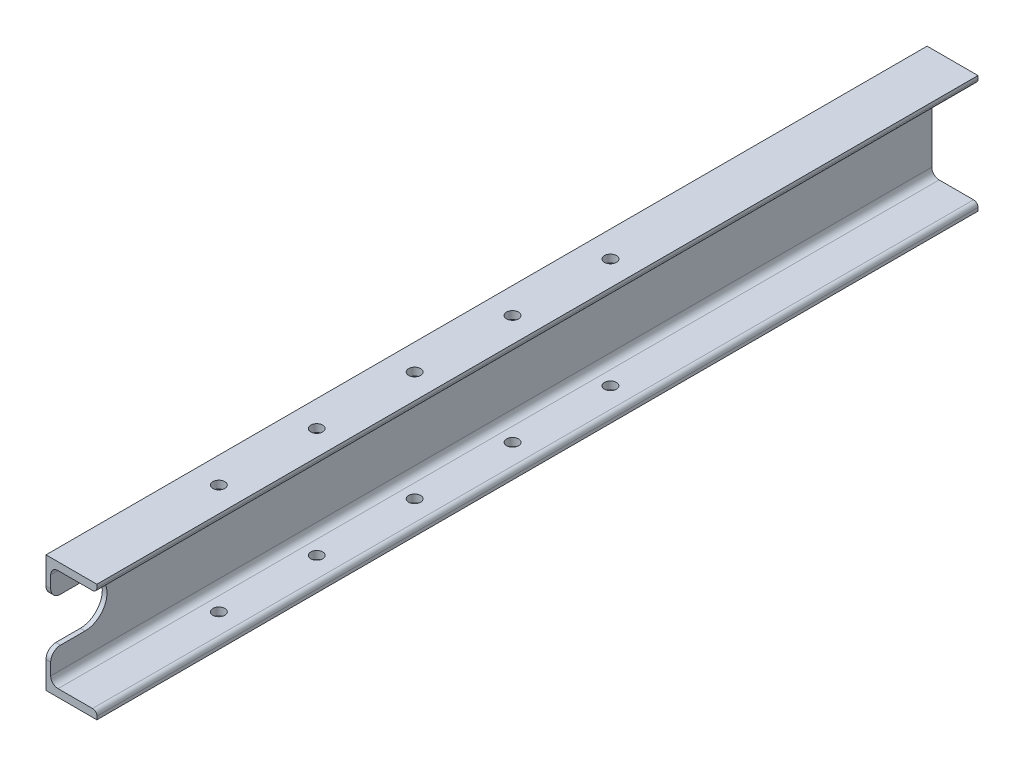
ISO-10303-21;
HEADER;
FILE_DESCRIPTION(('STEP AP214'),'2;1');
FILE_NAME('part.step','',(''),(''),'','','');
FILE_SCHEMA(('AUTOMOTIVE_DESIGN { 1 0 10303 214 1 1 1 1 }'));
ENDSEC;
DATA;
#1=APPLICATION_CONTEXT('core data for automotive mechanical design processes');
#2=APPLICATION_PROTOCOL_DEFINITION('international standard','automotive_design',2000,#1);
#3=PRODUCT_CONTEXT('',#1,'mechanical');
#4=PRODUCT('Part','Part','',(#3));
#5=PRODUCT_RELATED_PRODUCT_CATEGORY('part','',(#4));
#6=PRODUCT_DEFINITION_FORMATION('','',#4);
#7=PRODUCT_DEFINITION_CONTEXT('part definition',#1,'design');
#8=PRODUCT_DEFINITION('design','',#6,#7);
#9=PRODUCT_DEFINITION_SHAPE('','',#8);
#10=(LENGTH_UNIT() NAMED_UNIT(*) SI_UNIT(.MILLI.,.METRE.));
#11=(NAMED_UNIT(*) PLANE_ANGLE_UNIT() SI_UNIT($,.RADIAN.));
#12=(NAMED_UNIT(*) SI_UNIT($,.STERADIAN.) SOLID_ANGLE_UNIT());
#13=UNCERTAINTY_MEASURE_WITH_UNIT(LENGTH_MEASURE(1.E-05),#10,'distance_accuracy_value','');
#14=(GEOMETRIC_REPRESENTATION_CONTEXT(3) GLOBAL_UNCERTAINTY_ASSIGNED_CONTEXT((#13)) GLOBAL_UNIT_ASSIGNED_CONTEXT((#10,
#11,#12)) REPRESENTATION_CONTEXT('',''));
#15=CARTESIAN_POINT('',(0.,0.,0.));
#16=DIRECTION('',(0.,0.,1.));
#17=DIRECTION('',(1.,0.,0.));
#18=AXIS2_PLACEMENT_3D('',#15,#16,#17);
#19=CARTESIAN_POINT('',(47.5,56.7,450.));
#20=DIRECTION('',(0.,0.,-1.));
#21=DIRECTION('',(-1.,0.,0.));
#22=AXIS2_PLACEMENT_3D('',#19,#20,#21);
#23=PLANE('',#22);
#24=DIRECTION('',(0.,-1.,0.));
#25=VECTOR('',#24,1.);
#26=CARTESIAN_POINT('',(0.,-60.,450.));
#27=LINE('',#26,#25);
#28=CARTESIAN_POINT('',(0.,60.,450.));
#29=VERTEX_POINT('',#28);
#30=CARTESIAN_POINT('',(0.,32.5,450.));
#31=VERTEX_POINT('',#30);
#32=EDGE_CURVE('E297',#29,#31,#27,.T.);
#33=ORIENTED_EDGE('',*,*,#32,.T.);
#34=DIRECTION('',(1.,0.,0.));
#35=VECTOR('',#34,1.);
#36=CARTESIAN_POINT('',(47.5,32.5,450.));
#37=LINE('',#36,#35);
#38=CARTESIAN_POINT('',(4.80000000000001,32.5,450.));
#39=VERTEX_POINT('',#38);
#40=EDGE_CURVE('E55',#31,#39,#37,.T.);
#41=ORIENTED_EDGE('',*,*,#40,.T.);
#42=DIRECTION('',(0.,1.,0.));
#43=VECTOR('',#42,1.);
#44=CARTESIAN_POINT('',(4.80000000000001,44.6999999999999,450.));
#45=LINE('',#44,#43);
#46=CARTESIAN_POINT('',(4.80000000000001,44.6999999999999,450.));
#47=VERTEX_POINT('',#46);
#48=EDGE_CURVE('E316',#39,#47,#45,.T.);
#49=ORIENTED_EDGE('',*,*,#48,.T.);
#50=CARTESIAN_POINT('',(12.3,44.7,450.));
#51=DIRECTION('',(0.,0.,-1.));
#52=DIRECTION('',(1.,0.,0.));
#53=AXIS2_PLACEMENT_3D('',#50,#51,#52);
#54=CIRCLE('',#53,7.5);
#55=CARTESIAN_POINT('',(12.3000000000001,52.2,450.));
#56=VERTEX_POINT('',#55);
#57=EDGE_CURVE('E321',#47,#56,#54,.T.);
#58=ORIENTED_EDGE('',*,*,#57,.T.);
#59=DIRECTION('',(1.,0.,0.));
#60=VECTOR('',#59,1.);
#61=CARTESIAN_POINT('',(47.5,52.2,450.));
#62=LINE('',#61,#60);
#63=CARTESIAN_POINT('',(47.5,52.2,450.));
#64=VERTEX_POINT('',#63);
#65=EDGE_CURVE('E324',#56,#64,#62,.T.);
#66=ORIENTED_EDGE('',*,*,#65,.T.);
#67=CARTESIAN_POINT('',(47.5,56.7,450.));
#68=DIRECTION('',(0.,0.,1.));
#69=DIRECTION('',(-1.,0.,0.));
#70=AXIS2_PLACEMENT_3D('',#67,#68,#69);
#71=CIRCLE('',#70,4.5);
#72=CARTESIAN_POINT('',(52.,56.7,450.));
#73=VERTEX_POINT('',#72);
#74=EDGE_CURVE('E327',#64,#73,#71,.T.);
#75=ORIENTED_EDGE('',*,*,#74,.T.);
#76=DIRECTION('',(0.,1.,0.));
#77=VECTOR('',#76,1.);
#78=CARTESIAN_POINT('',(52.,60.,450.));
#79=LINE('',#78,#77);
#80=CARTESIAN_POINT('',(52.,60.,450.));
#81=VERTEX_POINT('',#80);
#82=EDGE_CURVE('E330',#73,#81,#79,.T.);
#83=ORIENTED_EDGE('',*,*,#82,.T.);
#84=DIRECTION('',(-1.,0.,0.));
#85=VECTOR('',#84,1.);
#86=CARTESIAN_POINT('',(0.,60.,450.));
#87=LINE('',#86,#85);
#88=EDGE_CURVE('E291',#81,#29,#87,.T.);
#89=ORIENTED_EDGE('',*,*,#88,.T.);
#90=EDGE_LOOP('',(#33,#41,#49,#58,#66,#75,#83,#89));
#91=FACE_BOUND('',#90,.T.);
#92=ADVANCED_FACE('F45',(#91),#23,.F.);
#93=CARTESIAN_POINT('',(0.,60.,450.));
#94=DIRECTION('',(0.,-1.,0.));
#95=DIRECTION('',(1.,0.,0.));
#96=AXIS2_PLACEMENT_3D('',#93,#94,#95);
#97=PLANE('',#96);
#98=CARTESIAN_POINT('',(26.5507517231734,60.,300.));
#99=DIRECTION('',(0.,-1.,0.));
#100=DIRECTION('',(1.,0.,0.));
#101=AXIS2_PLACEMENT_3D('',#98,#99,#100);
#102=CIRCLE('',#101,6.10000000000003);
#103=CARTESIAN_POINT('',(32.6507517231734,60.,300.));
#104=VERTEX_POINT('',#103);
#105=EDGE_CURVE('E195',#104,#104,#102,.T.);
#106=ORIENTED_EDGE('',*,*,#105,.T.);
#107=EDGE_LOOP('',(#106));
#108=FACE_BOUND('',#107,.T.);
#109=CARTESIAN_POINT('',(26.5507517231731,60.,200.));
#110=DIRECTION('',(0.,-1.,0.));
#111=DIRECTION('',(1.,0.,0.));
#112=AXIS2_PLACEMENT_3D('',#109,#110,#111);
#113=CIRCLE('',#112,6.10000000000003);
#114=CARTESIAN_POINT('',(32.6507517231731,60.,200.));
#115=VERTEX_POINT('',#114);
#116=EDGE_CURVE('E256',#115,#115,#113,.T.);
#117=ORIENTED_EDGE('',*,*,#116,.T.);
#118=EDGE_LOOP('',(#117));
#119=FACE_BOUND('',#118,.T.);
#120=CARTESIAN_POINT('',(26.5507517231727,60.,100.));
#121=DIRECTION('',(0.,-1.,0.));
#122=DIRECTION('',(1.,0.,0.));
#123=AXIS2_PLACEMENT_3D('',#120,#121,#122);
#124=CIRCLE('',#123,6.10000000000003);
#125=CARTESIAN_POINT('',(32.6507517231728,60.,100.));
#126=VERTEX_POINT('',#125);
#127=EDGE_CURVE('E249',#126,#126,#124,.T.);
#128=ORIENTED_EDGE('',*,*,#127,.T.);
#129=EDGE_LOOP('',(#128));
#130=FACE_BOUND('',#129,.T.);
#131=CARTESIAN_POINT('',(26.5507517231724,60.,1.66533453693773E-13));
#132=DIRECTION('',(0.,-1.,0.));
#133=DIRECTION('',(1.,0.,0.));
#134=AXIS2_PLACEMENT_3D('',#131,#132,#133);
#135=CIRCLE('',#134,6.10000000000003);
#136=CARTESIAN_POINT('',(32.6507517231724,60.,1.66533453693773E-13));
#137=VERTEX_POINT('',#136);
#138=EDGE_CURVE('E244',#137,#137,#135,.T.);
#139=ORIENTED_EDGE('',*,*,#138,.T.);
#140=EDGE_LOOP('',(#139));
#141=FACE_BOUND('',#140,.T.);
#142=CARTESIAN_POINT('',(26.550751723172,60.,-99.9999999999998));
#143=DIRECTION('',(0.,-1.,0.));
#144=DIRECTION('',(1.,0.,0.));
#145=AXIS2_PLACEMENT_3D('',#142,#143,#144);
#146=CIRCLE('',#145,6.10000000000003);
#147=CARTESIAN_POINT('',(32.6507517231721,60.,-99.9999999999998));
#148=VERTEX_POINT('',#147);
#149=EDGE_CURVE('E239',#148,#148,#146,.T.);
#150=ORIENTED_EDGE('',*,*,#149,.T.);
#151=EDGE_LOOP('',(#150));
#152=FACE_BOUND('',#151,.T.);
#153=DIRECTION('',(-1.,0.,0.));
#154=VECTOR('',#153,1.);
#155=CARTESIAN_POINT('',(0.,60.,-450.));
#156=LINE('',#155,#154);
#157=CARTESIAN_POINT('',(52.,60.,-450.));
#158=VERTEX_POINT('',#157);
#159=CARTESIAN_POINT('',(0.,60.,-450.));
#160=VERTEX_POINT('',#159);
#161=EDGE_CURVE('E290',#158,#160,#156,.T.);
#162=ORIENTED_EDGE('',*,*,#161,.T.);
#163=DIRECTION('',(0.,0.,-1.));
#164=VECTOR('',#163,1.);
#165=CARTESIAN_POINT('',(0.,60.,450.));
#166=LINE('',#165,#164);
#167=EDGE_CURVE('E201',#29,#160,#166,.T.);
#168=ORIENTED_EDGE('',*,*,#167,.F.);
#169=ORIENTED_EDGE('',*,*,#88,.F.);
#170=DIRECTION('',(0.,0.,-1.));
#171=VECTOR('',#170,1.);
#172=CARTESIAN_POINT('',(52.,60.,450.));
#173=LINE('',#172,#171);
#174=EDGE_CURVE('E333',#81,#158,#173,.T.);
#175=ORIENTED_EDGE('',*,*,#174,.T.);
#176=EDGE_LOOP('',(#162,#168,#169,#175));
#177=FACE_BOUND('',#176,.T.);
#178=ADVANCED_FACE('F480',(#108,#119,#130,#141,#152,#177),#97,.F.);
#179=CARTESIAN_POINT('',(0.,-60.,450.));
#180=DIRECTION('',(1.,0.,0.));
#181=DIRECTION('',(0.,0.,-1.));
#182=AXIS2_PLACEMENT_3D('',#179,#180,#181);
#183=PLANE('',#182);
#184=CARTESIAN_POINT('',(0.,-32.5,450.));
#185=VERTEX_POINT('',#184);
#186=CARTESIAN_POINT('',(0.,-60.,450.));
#187=VERTEX_POINT('',#186);
#188=EDGE_CURVE('E295',#185,#187,#27,.T.);
#189=ORIENTED_EDGE('',*,*,#188,.F.);
#190=CARTESIAN_POINT('',(0.,-32.5,440.));
#191=DIRECTION('',(1.,0.,0.));
#192=DIRECTION('',(0.,0.,-1.));
#193=AXIS2_PLACEMENT_3D('',#190,#191,#192);
#194=CIRCLE('',#193,10.);
#195=CARTESIAN_POINT('',(0.,-22.5,440.));
#196=VERTEX_POINT('',#195);
#197=EDGE_CURVE('E216',#185,#196,#194,.F.);
#198=ORIENTED_EDGE('',*,*,#197,.T.);
#199=DIRECTION('',(0.,0.,-1.));
#200=VECTOR('',#199,1.);
#201=CARTESIAN_POINT('',(0.,-22.5,450.));
#202=LINE('',#201,#200);
#203=CARTESIAN_POINT('',(0.,-22.5,415.));
#204=VERTEX_POINT('',#203);
#205=EDGE_CURVE('E182',#196,#204,#202,.T.);
#206=ORIENTED_EDGE('',*,*,#205,.T.);
#207=CARTESIAN_POINT('',(0.,0.,415.));
#208=DIRECTION('',(1.,0.,0.));
#209=DIRECTION('',(0.,0.,-1.));
#210=AXIS2_PLACEMENT_3D('',#207,#208,#209);
#211=CIRCLE('',#210,22.5);
#212=CARTESIAN_POINT('',(0.,22.5,415.));
#213=VERTEX_POINT('',#212);
#214=EDGE_CURVE('E193',#204,#213,#211,.T.);
#215=ORIENTED_EDGE('',*,*,#214,.T.);
#216=DIRECTION('',(0.,0.,1.));
#217=VECTOR('',#216,1.);
#218=CARTESIAN_POINT('',(0.,22.5,450.));
#219=LINE('',#218,#217);
#220=CARTESIAN_POINT('',(0.,22.5,440.));
#221=VERTEX_POINT('',#220);
#222=EDGE_CURVE('E284',#213,#221,#219,.T.);
#223=ORIENTED_EDGE('',*,*,#222,.T.);
#224=CARTESIAN_POINT('',(0.,32.5,440.));
#225=DIRECTION('',(1.,0.,0.));
#226=DIRECTION('',(0.,0.,-1.));
#227=AXIS2_PLACEMENT_3D('',#224,#225,#226);
#228=CIRCLE('',#227,10.);
#229=EDGE_CURVE('E207',#221,#31,#228,.F.);
#230=ORIENTED_EDGE('',*,*,#229,.T.);
#231=ORIENTED_EDGE('',*,*,#32,.F.);
#232=ORIENTED_EDGE('',*,*,#167,.T.);
#233=DIRECTION('',(0.,-1.,0.));
#234=VECTOR('',#233,1.);
#235=CARTESIAN_POINT('',(0.,-60.,-450.));
#236=LINE('',#235,#234);
#237=CARTESIAN_POINT('',(0.,-60.,-450.));
#238=VERTEX_POINT('',#237);
#239=EDGE_CURVE('E337',#160,#238,#236,.T.);
#240=ORIENTED_EDGE('',*,*,#239,.T.);
#241=DIRECTION('',(0.,0.,-1.));
#242=VECTOR('',#241,1.);
#243=CARTESIAN_POINT('',(0.,-60.,450.));
#244=LINE('',#243,#242);
#245=EDGE_CURVE('E210',#187,#238,#244,.T.);
#246=ORIENTED_EDGE('',*,*,#245,.F.);
#247=EDGE_LOOP('',(#189,#198,#206,#215,#223,#230,#231,#232,#240,#246));
#248=FACE_BOUND('',#247,.T.);
#249=ADVANCED_FACE('F483',(#248),#183,.F.);
#250=CARTESIAN_POINT('',(0.,-60.,450.));
#251=DIRECTION('',(0.,1.,0.));
#252=DIRECTION('',(-1.,0.,0.));
#253=AXIS2_PLACEMENT_3D('',#250,#251,#252);
#254=PLANE('',#253);
#255=CARTESIAN_POINT('',(26.5507517231734,-60.,300.));
#256=DIRECTION('',(0.,1.,0.));
#257=DIRECTION('',(-1.,0.,0.));
#258=AXIS2_PLACEMENT_3D('',#255,#256,#257);
#259=CIRCLE('',#258,6.10000000000003);
#260=CARTESIAN_POINT('',(20.4507517231734,-60.,300.));
#261=VERTEX_POINT('',#260);
#262=EDGE_CURVE('E233',#261,#261,#259,.T.);
#263=ORIENTED_EDGE('',*,*,#262,.T.);
#264=EDGE_LOOP('',(#263));
#265=FACE_BOUND('',#264,.T.);
#266=CARTESIAN_POINT('',(26.5507517231731,-60.,200.));
#267=DIRECTION('',(0.,1.,0.));
#268=DIRECTION('',(-1.,0.,0.));
#269=AXIS2_PLACEMENT_3D('',#266,#267,#268);
#270=CIRCLE('',#269,6.10000000000003);
#271=CARTESIAN_POINT('',(20.450751723173,-60.,200.));
#272=VERTEX_POINT('',#271);
#273=EDGE_CURVE('E774',#272,#272,#270,.T.);
#274=ORIENTED_EDGE('',*,*,#273,.T.);
#275=EDGE_LOOP('',(#274));
#276=FACE_BOUND('',#275,.T.);
#277=CARTESIAN_POINT('',(26.5507517231727,-60.,100.));
#278=DIRECTION('',(0.,1.,0.));
#279=DIRECTION('',(-1.,0.,0.));
#280=AXIS2_PLACEMENT_3D('',#277,#278,#279);
#281=CIRCLE('',#280,6.10000000000003);
#282=CARTESIAN_POINT('',(20.4507517231727,-60.,100.));
#283=VERTEX_POINT('',#282);
#284=EDGE_CURVE('E779',#283,#283,#281,.T.);
#285=ORIENTED_EDGE('',*,*,#284,.T.);
#286=EDGE_LOOP('',(#285));
#287=FACE_BOUND('',#286,.T.);
#288=CARTESIAN_POINT('',(26.5507517231724,-60.,1.66533453693773E-13));
#289=DIRECTION('',(0.,1.,0.));
#290=DIRECTION('',(-1.,0.,0.));
#291=AXIS2_PLACEMENT_3D('',#288,#289,#290);
#292=CIRCLE('',#291,6.10000000000003);
#293=CARTESIAN_POINT('',(20.4507517231723,-60.,1.66533453693773E-13));
#294=VERTEX_POINT('',#293);
#295=EDGE_CURVE('E785',#294,#294,#292,.T.);
#296=ORIENTED_EDGE('',*,*,#295,.T.);
#297=EDGE_LOOP('',(#296));
#298=FACE_BOUND('',#297,.T.);
#299=CARTESIAN_POINT('',(26.550751723172,-60.,-99.9999999999998));
#300=DIRECTION('',(0.,1.,0.));
#301=DIRECTION('',(-1.,0.,0.));
#302=AXIS2_PLACEMENT_3D('',#299,#300,#301);
#303=CIRCLE('',#302,6.10000000000003);
#304=CARTESIAN_POINT('',(20.450751723172,-60.,-99.9999999999998));
#305=VERTEX_POINT('',#304);
#306=EDGE_CURVE('E789',#305,#305,#303,.T.);
#307=ORIENTED_EDGE('',*,*,#306,.T.);
#308=EDGE_LOOP('',(#307));
#309=FACE_BOUND('',#308,.T.);
#310=DIRECTION('',(1.,0.,0.));
#311=VECTOR('',#310,1.);
#312=CARTESIAN_POINT('',(0.,-60.,-450.));
#313=LINE('',#312,#311);
#314=CARTESIAN_POINT('',(52.,-60.,-450.));
#315=VERTEX_POINT('',#314);
#316=EDGE_CURVE('E340',#238,#315,#313,.T.);
#317=ORIENTED_EDGE('',*,*,#316,.T.);
#318=DIRECTION('',(0.,0.,-1.));
#319=VECTOR('',#318,1.);
#320=CARTESIAN_POINT('',(52.,-60.,450.));
#321=LINE('',#320,#319);
#322=CARTESIAN_POINT('',(52.,-60.,450.));
#323=VERTEX_POINT('',#322);
#324=EDGE_CURVE('E404',#323,#315,#321,.T.);
#325=ORIENTED_EDGE('',*,*,#324,.F.);
#326=DIRECTION('',(1.,0.,0.));
#327=VECTOR('',#326,1.);
#328=CARTESIAN_POINT('',(0.,-60.,450.));
#329=LINE('',#328,#327);
#330=EDGE_CURVE('E301',#187,#323,#329,.T.);
#331=ORIENTED_EDGE('',*,*,#330,.F.);
#332=ORIENTED_EDGE('',*,*,#245,.T.);
#333=EDGE_LOOP('',(#317,#325,#331,#332));
#334=FACE_BOUND('',#333,.T.);
#335=ADVANCED_FACE('F414',(#265,#276,#287,#298,#309,#334),#254,.F.);
#336=CARTESIAN_POINT('',(52.,-60.,450.));
#337=DIRECTION('',(-1.,0.,0.));
#338=DIRECTION('',(0.,-1.,0.));
#339=AXIS2_PLACEMENT_3D('',#336,#337,#338);
#340=PLANE('',#339);
#341=DIRECTION('',(0.,1.,0.));
#342=VECTOR('',#341,1.);
#343=CARTESIAN_POINT('',(52.,-60.,-450.));
#344=LINE('',#343,#342);
#345=CARTESIAN_POINT('',(52.,-56.7,-450.));
#346=VERTEX_POINT('',#345);
#347=EDGE_CURVE('E343',#315,#346,#344,.T.);
#348=ORIENTED_EDGE('',*,*,#347,.T.);
#349=DIRECTION('',(0.,0.,-1.));
#350=VECTOR('',#349,1.);
#351=CARTESIAN_POINT('',(52.,-56.7,450.));
#352=LINE('',#351,#350);
#353=CARTESIAN_POINT('',(52.,-56.7,450.));
#354=VERTEX_POINT('',#353);
#355=EDGE_CURVE('E400',#354,#346,#352,.T.);
#356=ORIENTED_EDGE('',*,*,#355,.F.);
#357=DIRECTION('',(0.,1.,0.));
#358=VECTOR('',#357,1.);
#359=CARTESIAN_POINT('',(52.,-60.,450.));
#360=LINE('',#359,#358);
#361=EDGE_CURVE('E304',#323,#354,#360,.T.);
#362=ORIENTED_EDGE('',*,*,#361,.F.);
#363=ORIENTED_EDGE('',*,*,#324,.T.);
#364=EDGE_LOOP('',(#348,#356,#362,#363));
#365=FACE_BOUND('',#364,.T.);
#366=ADVANCED_FACE('F426',(#365),#340,.F.);
#367=CARTESIAN_POINT('',(47.5,-56.7,450.));
#368=DIRECTION('',(0.,0.,-1.));
#369=DIRECTION('',(-1.,0.,0.));
#370=AXIS2_PLACEMENT_3D('',#367,#368,#369);
#371=CYLINDRICAL_SURFACE('',#370,4.5);
#372=CARTESIAN_POINT('',(47.5,-56.7,-450.));
#373=DIRECTION('',(0.,0.,1.));
#374=DIRECTION('',(-1.,0.,0.));
#375=AXIS2_PLACEMENT_3D('',#372,#373,#374);
#376=CIRCLE('',#375,4.5);
#377=CARTESIAN_POINT('',(47.5,-52.2,-450.));
#378=VERTEX_POINT('',#377);
#379=EDGE_CURVE('E346',#346,#378,#376,.T.);
#380=ORIENTED_EDGE('',*,*,#379,.T.);
#381=DIRECTION('',(0.,0.,-1.));
#382=VECTOR('',#381,1.);
#383=CARTESIAN_POINT('',(47.5,-52.2,450.));
#384=LINE('',#383,#382);
#385=CARTESIAN_POINT('',(47.5,-52.2,450.));
#386=VERTEX_POINT('',#385);
#387=EDGE_CURVE('E396',#386,#378,#384,.T.);
#388=ORIENTED_EDGE('',*,*,#387,.F.);
#389=CARTESIAN_POINT('',(47.5,-56.7,450.));
#390=DIRECTION('',(0.,0.,1.));
#391=DIRECTION('',(-1.,0.,0.));
#392=AXIS2_PLACEMENT_3D('',#389,#390,#391);
#393=CIRCLE('',#392,4.5);
#394=EDGE_CURVE('E307',#354,#386,#393,.T.);
#395=ORIENTED_EDGE('',*,*,#394,.F.);
#396=ORIENTED_EDGE('',*,*,#355,.T.);
#397=EDGE_LOOP('',(#380,#388,#395,#396));
#398=FACE_BOUND('',#397,.T.);
#399=ADVANCED_FACE('F430',(#398),#371,.T.);
#400=CARTESIAN_POINT('',(47.5,-52.2,450.));
#401=DIRECTION('',(0.,-1.,0.));
#402=DIRECTION('',(1.,0.,0.));
#403=AXIS2_PLACEMENT_3D('',#400,#401,#402);
#404=PLANE('',#403);
#405=CARTESIAN_POINT('',(26.5507517231734,-52.2,300.));
#406=DIRECTION('',(0.,-1.,0.));
#407=DIRECTION('',(1.,0.,0.));
#408=AXIS2_PLACEMENT_3D('',#405,#406,#407);
#409=CIRCLE('',#408,6.10000000000003);
#410=CARTESIAN_POINT('',(32.6507517231734,-52.2,300.));
#411=VERTEX_POINT('',#410);
#412=EDGE_CURVE('E271',#411,#411,#409,.T.);
#413=ORIENTED_EDGE('',*,*,#412,.T.);
#414=EDGE_LOOP('',(#413));
#415=FACE_BOUND('',#414,.T.);
#416=CARTESIAN_POINT('',(26.5507517231731,-52.2,200.));
#417=DIRECTION('',(0.,-1.,0.));
#418=DIRECTION('',(1.,0.,0.));
#419=AXIS2_PLACEMENT_3D('',#416,#417,#418);
#420=CIRCLE('',#419,6.10000000000003);
#421=CARTESIAN_POINT('',(32.6507517231731,-52.2,200.));
#422=VERTEX_POINT('',#421);
#423=EDGE_CURVE('E248',#422,#422,#420,.T.);
#424=ORIENTED_EDGE('',*,*,#423,.T.);
#425=EDGE_LOOP('',(#424));
#426=FACE_BOUND('',#425,.T.);
#427=CARTESIAN_POINT('',(26.5507517231727,-52.2,100.));
#428=DIRECTION('',(0.,-1.,0.));
#429=DIRECTION('',(1.,0.,0.));
#430=AXIS2_PLACEMENT_3D('',#427,#428,#429);
#431=CIRCLE('',#430,6.10000000000003);
#432=CARTESIAN_POINT('',(32.6507517231727,-52.2,100.));
#433=VERTEX_POINT('',#432);
#434=EDGE_CURVE('E243',#433,#433,#431,.T.);
#435=ORIENTED_EDGE('',*,*,#434,.T.);
#436=EDGE_LOOP('',(#435));
#437=FACE_BOUND('',#436,.T.);
#438=CARTESIAN_POINT('',(26.5507517231724,-52.2,1.66533453693773E-13));
#439=DIRECTION('',(0.,-1.,0.));
#440=DIRECTION('',(1.,0.,0.));
#441=AXIS2_PLACEMENT_3D('',#438,#439,#440);
#442=CIRCLE('',#441,6.10000000000003);
#443=CARTESIAN_POINT('',(32.6507517231724,-52.2,1.66533453693773E-13));
#444=VERTEX_POINT('',#443);
#445=EDGE_CURVE('E238',#444,#444,#442,.T.);
#446=ORIENTED_EDGE('',*,*,#445,.T.);
#447=EDGE_LOOP('',(#446));
#448=FACE_BOUND('',#447,.T.);
#449=CARTESIAN_POINT('',(26.550751723172,-52.2,-99.9999999999998));
#450=DIRECTION('',(0.,-1.,0.));
#451=DIRECTION('',(1.,0.,0.));
#452=AXIS2_PLACEMENT_3D('',#449,#450,#451);
#453=CIRCLE('',#452,6.10000000000003);
#454=CARTESIAN_POINT('',(32.6507517231721,-52.2,-99.9999999999998));
#455=VERTEX_POINT('',#454);
#456=EDGE_CURVE('E232',#455,#455,#453,.T.);
#457=ORIENTED_EDGE('',*,*,#456,.T.);
#458=EDGE_LOOP('',(#457));
#459=FACE_BOUND('',#458,.T.);
#460=DIRECTION('',(-1.,0.,0.));
#461=VECTOR('',#460,1.);
#462=CARTESIAN_POINT('',(47.5,-52.2,-450.));
#463=LINE('',#462,#461);
#464=CARTESIAN_POINT('',(12.3000000000001,-52.2,-450.));
#465=VERTEX_POINT('',#464);
#466=EDGE_CURVE('E349',#378,#465,#463,.T.);
#467=ORIENTED_EDGE('',*,*,#466,.T.);
#468=DIRECTION('',(0.,0.,-1.));
#469=VECTOR('',#468,1.);
#470=CARTESIAN_POINT('',(12.3000000000001,-52.2,450.));
#471=LINE('',#470,#469);
#472=CARTESIAN_POINT('',(12.3000000000001,-52.2,450.));
#473=VERTEX_POINT('',#472);
#474=EDGE_CURVE('E392',#473,#465,#471,.T.);
#475=ORIENTED_EDGE('',*,*,#474,.F.);
#476=DIRECTION('',(-1.,0.,0.));
#477=VECTOR('',#476,1.);
#478=CARTESIAN_POINT('',(47.5,-52.2,450.));
#479=LINE('',#478,#477);
#480=EDGE_CURVE('E310',#386,#473,#479,.T.);
#481=ORIENTED_EDGE('',*,*,#480,.F.);
#482=ORIENTED_EDGE('',*,*,#387,.T.);
#483=EDGE_LOOP('',(#467,#475,#481,#482));
#484=FACE_BOUND('',#483,.T.);
#485=ADVANCED_FACE('F523',(#415,#426,#437,#448,#459,#484),#404,.F.);
#486=CARTESIAN_POINT('',(12.3,-44.7,450.));
#487=DIRECTION('',(0.,0.,-1.));
#488=DIRECTION('',(-1.,0.,0.));
#489=AXIS2_PLACEMENT_3D('',#486,#487,#488);
#490=CYLINDRICAL_SURFACE('',#489,7.5);
#491=CARTESIAN_POINT('',(12.3,-44.7,-450.));
#492=DIRECTION('',(0.,0.,-1.));
#493=DIRECTION('',(-1.,0.,0.));
#494=AXIS2_PLACEMENT_3D('',#491,#492,#493);
#495=CIRCLE('',#494,7.5);
#496=CARTESIAN_POINT('',(4.80000000000001,-44.7,-450.));
#497=VERTEX_POINT('',#496);
#498=EDGE_CURVE('E352',#465,#497,#495,.T.);
#499=ORIENTED_EDGE('',*,*,#498,.T.);
#500=DIRECTION('',(0.,0.,-1.));
#501=VECTOR('',#500,1.);
#502=CARTESIAN_POINT('',(4.80000000000001,-44.7,450.));
#503=LINE('',#502,#501);
#504=CARTESIAN_POINT('',(4.80000000000001,-44.7,450.));
#505=VERTEX_POINT('',#504);
#506=EDGE_CURVE('E388',#505,#497,#503,.T.);
#507=ORIENTED_EDGE('',*,*,#506,.F.);
#508=CARTESIAN_POINT('',(12.3,-44.7,450.));
#509=DIRECTION('',(0.,0.,-1.));
#510=DIRECTION('',(-1.,0.,0.));
#511=AXIS2_PLACEMENT_3D('',#508,#509,#510);
#512=CIRCLE('',#511,7.5);
#513=EDGE_CURVE('E313',#473,#505,#512,.T.);
#514=ORIENTED_EDGE('',*,*,#513,.F.);
#515=ORIENTED_EDGE('',*,*,#474,.T.);
#516=EDGE_LOOP('',(#499,#507,#514,#515));
#517=FACE_BOUND('',#516,.T.);
#518=ADVANCED_FACE('F521',(#517),#490,.F.);
#519=CARTESIAN_POINT('',(4.80000000000001,44.6999999999999,450.));
#520=DIRECTION('',(-1.,0.,0.));
#521=DIRECTION('',(0.,0.,1.));
#522=AXIS2_PLACEMENT_3D('',#519,#520,#521);
#523=PLANE('',#522);
#524=DIRECTION('',(0.,0.,1.));
#525=VECTOR('',#524,1.);
#526=CARTESIAN_POINT('',(4.80000000000001,-22.5,450.));
#527=LINE('',#526,#525);
#528=CARTESIAN_POINT('',(4.80000000000001,-22.5,415.));
#529=VERTEX_POINT('',#528);
#530=CARTESIAN_POINT('',(4.80000000000001,-22.5,440.));
#531=VERTEX_POINT('',#530);
#532=EDGE_CURVE('E172',#529,#531,#527,.T.);
#533=ORIENTED_EDGE('',*,*,#532,.T.);
#534=CARTESIAN_POINT('',(4.80000000000001,-32.5,440.));
#535=DIRECTION('',(-1.,0.,0.));
#536=DIRECTION('',(0.,0.,1.));
#537=AXIS2_PLACEMENT_3D('',#534,#535,#536);
#538=CIRCLE('',#537,10.);
#539=CARTESIAN_POINT('',(4.80000000000001,-32.5,450.));
#540=VERTEX_POINT('',#539);
#541=EDGE_CURVE('E223',#531,#540,#538,.F.);
#542=ORIENTED_EDGE('',*,*,#541,.T.);
#543=EDGE_CURVE('E317',#505,#540,#45,.T.);
#544=ORIENTED_EDGE('',*,*,#543,.F.);
#545=ORIENTED_EDGE('',*,*,#506,.T.);
#546=DIRECTION('',(0.,1.,0.));
#547=VECTOR('',#546,1.);
#548=CARTESIAN_POINT('',(4.80000000000001,44.6999999999999,-450.));
#549=LINE('',#548,#547);
#550=CARTESIAN_POINT('',(4.80000000000001,44.6999999999999,-450.));
#551=VERTEX_POINT('',#550);
#552=EDGE_CURVE('E355',#497,#551,#549,.T.);
#553=ORIENTED_EDGE('',*,*,#552,.T.);
#554=DIRECTION('',(0.,0.,-1.));
#555=VECTOR('',#554,1.);
#556=CARTESIAN_POINT('',(4.80000000000001,44.6999999999999,450.));
#557=LINE('',#556,#555);
#558=EDGE_CURVE('E384',#47,#551,#557,.T.);
#559=ORIENTED_EDGE('',*,*,#558,.F.);
#560=ORIENTED_EDGE('',*,*,#48,.F.);
#561=CARTESIAN_POINT('',(4.80000000000001,32.5,440.));
#562=DIRECTION('',(-1.,0.,0.));
#563=DIRECTION('',(0.,0.,1.));
#564=AXIS2_PLACEMENT_3D('',#561,#562,#563);
#565=CIRCLE('',#564,10.);
#566=CARTESIAN_POINT('',(4.80000000000001,22.5,440.));
#567=VERTEX_POINT('',#566);
#568=EDGE_CURVE('E63',#39,#567,#565,.F.);
#569=ORIENTED_EDGE('',*,*,#568,.T.);
#570=DIRECTION('',(0.,0.,-1.));
#571=VECTOR('',#570,1.);
#572=CARTESIAN_POINT('',(4.80000000000001,22.5,450.));
#573=LINE('',#572,#571);
#574=CARTESIAN_POINT('',(4.80000000000001,22.5,415.));
#575=VERTEX_POINT('',#574);
#576=EDGE_CURVE('E198',#567,#575,#573,.T.);
#577=ORIENTED_EDGE('',*,*,#576,.T.);
#578=CARTESIAN_POINT('',(4.80000000000001,0.,415.));
#579=DIRECTION('',(-1.,0.,0.));
#580=DIRECTION('',(0.,0.,1.));
#581=AXIS2_PLACEMENT_3D('',#578,#579,#580);
#582=CIRCLE('',#581,22.5);
#583=EDGE_CURVE('E190',#575,#529,#582,.T.);
#584=ORIENTED_EDGE('',*,*,#583,.T.);
#585=EDGE_LOOP('',(#533,#542,#544,#545,#553,#559,#560,#569,#577,#584));
#586=FACE_BOUND('',#585,.T.);
#587=ADVANCED_FACE('F197',(#586),#523,.F.);
#588=CARTESIAN_POINT('',(12.3,44.7,450.));
#589=DIRECTION('',(0.,0.,-1.));
#590=DIRECTION('',(-1.,0.,0.));
#591=AXIS2_PLACEMENT_3D('',#588,#589,#590);
#592=CYLINDRICAL_SURFACE('',#591,7.5);
#593=CARTESIAN_POINT('',(12.3,44.7,-450.));
#594=DIRECTION('',(0.,0.,-1.));
#595=DIRECTION('',(1.,0.,0.));
#596=AXIS2_PLACEMENT_3D('',#593,#594,#595);
#597=CIRCLE('',#596,7.5);
#598=CARTESIAN_POINT('',(12.3000000000001,52.2,-450.));
#599=VERTEX_POINT('',#598);
#600=EDGE_CURVE('E358',#551,#599,#597,.T.);
#601=ORIENTED_EDGE('',*,*,#600,.T.);
#602=DIRECTION('',(0.,0.,-1.));
#603=VECTOR('',#602,1.);
#604=CARTESIAN_POINT('',(12.3000000000001,52.2,450.));
#605=LINE('',#604,#603);
#606=EDGE_CURVE('E380',#56,#599,#605,.T.);
#607=ORIENTED_EDGE('',*,*,#606,.F.);
#608=ORIENTED_EDGE('',*,*,#57,.F.);
#609=ORIENTED_EDGE('',*,*,#558,.T.);
#610=EDGE_LOOP('',(#601,#607,#608,#609));
#611=FACE_BOUND('',#610,.T.);
#612=ADVANCED_FACE('F514',(#611),#592,.F.);
#613=CARTESIAN_POINT('',(47.5,52.2,450.));
#614=DIRECTION('',(0.,1.,0.));
#615=DIRECTION('',(-1.,0.,0.));
#616=AXIS2_PLACEMENT_3D('',#613,#614,#615);
#617=PLANE('',#616);
#618=CARTESIAN_POINT('',(26.5507517231734,52.2,300.));
#619=DIRECTION('',(0.,1.,0.));
#620=DIRECTION('',(-1.,0.,0.));
#621=AXIS2_PLACEMENT_3D('',#618,#619,#620);
#622=CIRCLE('',#621,6.10000000000003);
#623=CARTESIAN_POINT('',(20.4507517231734,52.2,300.));
#624=VERTEX_POINT('',#623);
#625=EDGE_CURVE('E49',#624,#624,#622,.T.);
#626=ORIENTED_EDGE('',*,*,#625,.T.);
#627=EDGE_LOOP('',(#626));
#628=FACE_BOUND('',#627,.T.);
#629=CARTESIAN_POINT('',(26.5507517231731,52.2,200.));
#630=DIRECTION('',(0.,1.,0.));
#631=DIRECTION('',(-1.,0.,0.));
#632=AXIS2_PLACEMENT_3D('',#629,#630,#631);
#633=CIRCLE('',#632,6.10000000000003);
#634=CARTESIAN_POINT('',(20.450751723173,52.2,200.));
#635=VERTEX_POINT('',#634);
#636=EDGE_CURVE('E245',#635,#635,#633,.T.);
#637=ORIENTED_EDGE('',*,*,#636,.T.);
#638=EDGE_LOOP('',(#637));
#639=FACE_BOUND('',#638,.T.);
#640=CARTESIAN_POINT('',(26.5507517231727,52.2,100.));
#641=DIRECTION('',(0.,1.,0.));
#642=DIRECTION('',(-1.,0.,0.));
#643=AXIS2_PLACEMENT_3D('',#640,#641,#642);
#644=CIRCLE('',#643,6.10000000000003);
#645=CARTESIAN_POINT('',(20.4507517231727,52.2,100.));
#646=VERTEX_POINT('',#645);
#647=EDGE_CURVE('E240',#646,#646,#644,.T.);
#648=ORIENTED_EDGE('',*,*,#647,.T.);
#649=EDGE_LOOP('',(#648));
#650=FACE_BOUND('',#649,.T.);
#651=CARTESIAN_POINT('',(26.5507517231724,52.2,1.66533453693773E-13));
#652=DIRECTION('',(0.,1.,0.));
#653=DIRECTION('',(-1.,0.,0.));
#654=AXIS2_PLACEMENT_3D('',#651,#652,#653);
#655=CIRCLE('',#654,6.10000000000003);
#656=CARTESIAN_POINT('',(20.4507517231724,52.2,1.66533453693773E-13));
#657=VERTEX_POINT('',#656);
#658=EDGE_CURVE('E234',#657,#657,#655,.T.);
#659=ORIENTED_EDGE('',*,*,#658,.T.);
#660=EDGE_LOOP('',(#659));
#661=FACE_BOUND('',#660,.T.);
#662=CARTESIAN_POINT('',(26.550751723172,52.2,-99.9999999999998));
#663=DIRECTION('',(0.,1.,0.));
#664=DIRECTION('',(-1.,0.,0.));
#665=AXIS2_PLACEMENT_3D('',#662,#663,#664);
#666=CIRCLE('',#665,6.10000000000003);
#667=CARTESIAN_POINT('',(20.450751723172,52.2,-99.9999999999998));
#668=VERTEX_POINT('',#667);
#669=EDGE_CURVE('E228',#668,#668,#666,.T.);
#670=ORIENTED_EDGE('',*,*,#669,.T.);
#671=EDGE_LOOP('',(#670));
#672=FACE_BOUND('',#671,.T.);
#673=DIRECTION('',(1.,0.,0.));
#674=VECTOR('',#673,1.);
#675=CARTESIAN_POINT('',(47.5,52.2,-450.));
#676=LINE('',#675,#674);
#677=CARTESIAN_POINT('',(47.5,52.2,-450.));
#678=VERTEX_POINT('',#677);
#679=EDGE_CURVE('E361',#599,#678,#676,.T.);
#680=ORIENTED_EDGE('',*,*,#679,.T.);
#681=DIRECTION('',(0.,0.,-1.));
#682=VECTOR('',#681,1.);
#683=CARTESIAN_POINT('',(47.5,52.2,450.));
#684=LINE('',#683,#682);
#685=EDGE_CURVE('E376',#64,#678,#684,.T.);
#686=ORIENTED_EDGE('',*,*,#685,.F.);
#687=ORIENTED_EDGE('',*,*,#65,.F.);
#688=ORIENTED_EDGE('',*,*,#606,.T.);
#689=EDGE_LOOP('',(#680,#686,#687,#688));
#690=FACE_BOUND('',#689,.T.);
#691=ADVANCED_FACE('F469',(#628,#639,#650,#661,#672,#690),#617,.F.);
#692=CARTESIAN_POINT('',(47.5,56.7,450.));
#693=DIRECTION('',(0.,0.,-1.));
#694=DIRECTION('',(-1.,0.,0.));
#695=AXIS2_PLACEMENT_3D('',#692,#693,#694);
#696=CYLINDRICAL_SURFACE('',#695,4.5);
#697=CARTESIAN_POINT('',(47.5,56.7,-450.));
#698=DIRECTION('',(0.,0.,1.));
#699=DIRECTION('',(-1.,0.,0.));
#700=AXIS2_PLACEMENT_3D('',#697,#698,#699);
#701=CIRCLE('',#700,4.5);
#702=CARTESIAN_POINT('',(52.,56.7,-450.));
#703=VERTEX_POINT('',#702);
#704=EDGE_CURVE('E364',#678,#703,#701,.T.);
#705=ORIENTED_EDGE('',*,*,#704,.T.);
#706=DIRECTION('',(0.,0.,-1.));
#707=VECTOR('',#706,1.);
#708=CARTESIAN_POINT('',(52.,56.7,450.));
#709=LINE('',#708,#707);
#710=EDGE_CURVE('E372',#73,#703,#709,.T.);
#711=ORIENTED_EDGE('',*,*,#710,.F.);
#712=ORIENTED_EDGE('',*,*,#74,.F.);
#713=ORIENTED_EDGE('',*,*,#685,.T.);
#714=EDGE_LOOP('',(#705,#711,#712,#713));
#715=FACE_BOUND('',#714,.T.);
#716=ADVANCED_FACE('F505',(#715),#696,.T.);
#717=CARTESIAN_POINT('',(52.,60.,450.));
#718=DIRECTION('',(-1.,0.,0.));
#719=DIRECTION('',(0.,-1.,0.));
#720=AXIS2_PLACEMENT_3D('',#717,#718,#719);
#721=PLANE('',#720);
#722=DIRECTION('',(0.,1.,0.));
#723=VECTOR('',#722,1.);
#724=CARTESIAN_POINT('',(52.,60.,-450.));
#725=LINE('',#724,#723);
#726=EDGE_CURVE('E296',#703,#158,#725,.T.);
#727=ORIENTED_EDGE('',*,*,#726,.T.);
#728=ORIENTED_EDGE('',*,*,#174,.F.);
#729=ORIENTED_EDGE('',*,*,#82,.F.);
#730=ORIENTED_EDGE('',*,*,#710,.T.);
#731=EDGE_LOOP('',(#727,#728,#729,#730));
#732=FACE_BOUND('',#731,.T.);
#733=ADVANCED_FACE('F500',(#732),#721,.F.);
#734=ORIENTED_EDGE('',*,*,#543,.T.);
#735=DIRECTION('',(-1.,0.,0.));
#736=VECTOR('',#735,1.);
#737=CARTESIAN_POINT('',(47.5,-32.5,450.));
#738=LINE('',#737,#736);
#739=EDGE_CURVE('E200',#540,#185,#738,.T.);
#740=ORIENTED_EDGE('',*,*,#739,.T.);
#741=ORIENTED_EDGE('',*,*,#188,.T.);
#742=ORIENTED_EDGE('',*,*,#330,.T.);
#743=ORIENTED_EDGE('',*,*,#361,.T.);
#744=ORIENTED_EDGE('',*,*,#394,.T.);
#745=ORIENTED_EDGE('',*,*,#480,.T.);
#746=ORIENTED_EDGE('',*,*,#513,.T.);
#747=EDGE_LOOP('',(#734,#740,#741,#742,#743,#744,#745,#746));
#748=FACE_BOUND('',#747,.T.);
#749=ADVANCED_FACE('F434',(#748),#23,.F.);
#750=CARTESIAN_POINT('',(47.5,56.7,-450.));
#751=DIRECTION('',(0.,0.,-1.));
#752=DIRECTION('',(-1.,0.,0.));
#753=AXIS2_PLACEMENT_3D('',#750,#751,#752);
#754=PLANE('',#753);
#755=ORIENTED_EDGE('',*,*,#161,.F.);
#756=ORIENTED_EDGE('',*,*,#726,.F.);
#757=ORIENTED_EDGE('',*,*,#704,.F.);
#758=ORIENTED_EDGE('',*,*,#679,.F.);
#759=ORIENTED_EDGE('',*,*,#600,.F.);
#760=ORIENTED_EDGE('',*,*,#552,.F.);
#761=ORIENTED_EDGE('',*,*,#498,.F.);
#762=ORIENTED_EDGE('',*,*,#466,.F.);
#763=ORIENTED_EDGE('',*,*,#379,.F.);
#764=ORIENTED_EDGE('',*,*,#347,.F.);
#765=ORIENTED_EDGE('',*,*,#316,.F.);
#766=ORIENTED_EDGE('',*,*,#239,.F.);
#767=EDGE_LOOP('',(#755,#756,#757,#758,#759,#760,#761,#762,#763,#764,#765,#766));
#768=FACE_BOUND('',#767,.T.);
#769=ADVANCED_FACE('F421',(#768),#754,.T.);
#770=CARTESIAN_POINT('',(5.,0.,415.));
#771=DIRECTION('',(-1.,0.,0.));
#772=DIRECTION('',(0.,0.,1.));
#773=AXIS2_PLACEMENT_3D('',#770,#771,#772);
#774=CYLINDRICAL_SURFACE('',#773,22.5);
#775=DIRECTION('',(-1.,0.,0.));
#776=VECTOR('',#775,1.);
#777=CARTESIAN_POINT('',(5.,-22.5,415.));
#778=LINE('',#777,#776);
#779=EDGE_CURVE('E176',#529,#204,#778,.T.);
#780=ORIENTED_EDGE('',*,*,#779,.F.);
#781=ORIENTED_EDGE('',*,*,#583,.F.);
#782=DIRECTION('',(-1.,0.,0.));
#783=VECTOR('',#782,1.);
#784=CARTESIAN_POINT('',(5.,22.5,415.));
#785=LINE('',#784,#783);
#786=EDGE_CURVE('E183',#575,#213,#785,.T.);
#787=ORIENTED_EDGE('',*,*,#786,.T.);
#788=ORIENTED_EDGE('',*,*,#214,.F.);
#789=EDGE_LOOP('',(#780,#781,#787,#788));
#790=FACE_BOUND('',#789,.T.);
#791=ADVANCED_FACE('F188',(#790),#774,.F.);
#792=CARTESIAN_POINT('',(5.,22.5,415.));
#793=DIRECTION('',(0.,1.,0.));
#794=DIRECTION('',(0.,0.,1.));
#795=AXIS2_PLACEMENT_3D('',#792,#793,#794);
#796=PLANE('',#795);
#797=ORIENTED_EDGE('',*,*,#576,.F.);
#798=DIRECTION('',(1.,0.,0.));
#799=VECTOR('',#798,1.);
#800=CARTESIAN_POINT('',(5.,22.5,440.));
#801=LINE('',#800,#799);
#802=EDGE_CURVE('E11',#567,#221,#801,.F.);
#803=ORIENTED_EDGE('',*,*,#802,.T.);
#804=ORIENTED_EDGE('',*,*,#222,.F.);
#805=ORIENTED_EDGE('',*,*,#786,.F.);
#806=EDGE_LOOP('',(#797,#803,#804,#805));
#807=FACE_BOUND('',#806,.T.);
#808=ADVANCED_FACE('F647',(#807),#796,.F.);
#809=CARTESIAN_POINT('',(5.,-22.5,450.));
#810=DIRECTION('',(0.,-1.,0.));
#811=DIRECTION('',(0.,0.,-1.));
#812=AXIS2_PLACEMENT_3D('',#809,#810,#811);
#813=PLANE('',#812);
#814=ORIENTED_EDGE('',*,*,#205,.F.);
#815=DIRECTION('',(-1.,0.,0.));
#816=VECTOR('',#815,1.);
#817=CARTESIAN_POINT('',(5.,-22.5,440.));
#818=LINE('',#817,#816);
#819=EDGE_CURVE('E178',#196,#531,#818,.F.);
#820=ORIENTED_EDGE('',*,*,#819,.T.);
#821=ORIENTED_EDGE('',*,*,#532,.F.);
#822=ORIENTED_EDGE('',*,*,#779,.T.);
#823=EDGE_LOOP('',(#814,#820,#821,#822));
#824=FACE_BOUND('',#823,.T.);
#825=ADVANCED_FACE('F175',(#824),#813,.F.);
#826=CARTESIAN_POINT('',(47.5,-32.5,440.));
#827=DIRECTION('',(-1.,0.,0.));
#828=DIRECTION('',(0.,0.,1.));
#829=AXIS2_PLACEMENT_3D('',#826,#827,#828);
#830=CYLINDRICAL_SURFACE('',#829,10.);
#831=ORIENTED_EDGE('',*,*,#541,.F.);
#832=ORIENTED_EDGE('',*,*,#819,.F.);
#833=ORIENTED_EDGE('',*,*,#197,.F.);
#834=ORIENTED_EDGE('',*,*,#739,.F.);
#835=EDGE_LOOP('',(#831,#832,#833,#834));
#836=FACE_BOUND('',#835,.T.);
#837=ADVANCED_FACE('F663',(#836),#830,.T.);
#838=CARTESIAN_POINT('',(47.5,32.5,440.));
#839=DIRECTION('',(1.,0.,0.));
#840=DIRECTION('',(0.,0.,-1.));
#841=AXIS2_PLACEMENT_3D('',#838,#839,#840);
#842=CYLINDRICAL_SURFACE('',#841,10.);
#843=ORIENTED_EDGE('',*,*,#229,.F.);
#844=ORIENTED_EDGE('',*,*,#802,.F.);
#845=ORIENTED_EDGE('',*,*,#568,.F.);
#846=ORIENTED_EDGE('',*,*,#40,.F.);
#847=EDGE_LOOP('',(#843,#844,#845,#846));
#848=FACE_BOUND('',#847,.T.);
#849=ADVANCED_FACE('F47',(#848),#842,.T.);
#850=CARTESIAN_POINT('',(26.550751723172,-60.,-99.9999999999998));
#851=DIRECTION('',(0.,1.,0.));
#852=DIRECTION('',(-1.,0.,0.));
#853=AXIS2_PLACEMENT_3D('',#850,#851,#852);
#854=CYLINDRICAL_SURFACE('',#853,6.10000000000003);
#855=ORIENTED_EDGE('',*,*,#669,.F.);
#856=EDGE_LOOP('',(#855));
#857=FACE_BOUND('',#856,.T.);
#858=ORIENTED_EDGE('',*,*,#149,.F.);
#859=EDGE_LOOP('',(#858));
#860=FACE_BOUND('',#859,.T.);
#861=ADVANCED_FACE('F680',(#857,#860),#854,.F.);
#862=CARTESIAN_POINT('',(26.5507517231724,-60.,1.66533453693773E-13));
#863=DIRECTION('',(0.,1.,0.));
#864=DIRECTION('',(-1.,0.,0.));
#865=AXIS2_PLACEMENT_3D('',#862,#863,#864);
#866=CYLINDRICAL_SURFACE('',#865,6.10000000000003);
#867=ORIENTED_EDGE('',*,*,#658,.F.);
#868=EDGE_LOOP('',(#867));
#869=FACE_BOUND('',#868,.T.);
#870=ORIENTED_EDGE('',*,*,#138,.F.);
#871=EDGE_LOOP('',(#870));
#872=FACE_BOUND('',#871,.T.);
#873=ADVANCED_FACE('F688',(#869,#872),#866,.F.);
#874=CARTESIAN_POINT('',(26.5507517231727,-60.,100.));
#875=DIRECTION('',(0.,1.,0.));
#876=DIRECTION('',(-1.,0.,0.));
#877=AXIS2_PLACEMENT_3D('',#874,#875,#876);
#878=CYLINDRICAL_SURFACE('',#877,6.10000000000003);
#879=ORIENTED_EDGE('',*,*,#647,.F.);
#880=EDGE_LOOP('',(#879));
#881=FACE_BOUND('',#880,.T.);
#882=ORIENTED_EDGE('',*,*,#127,.F.);
#883=EDGE_LOOP('',(#882));
#884=FACE_BOUND('',#883,.T.);
#885=ADVANCED_FACE('F698',(#881,#884),#878,.F.);
#886=CARTESIAN_POINT('',(26.5507517231731,-60.,200.));
#887=DIRECTION('',(0.,1.,0.));
#888=DIRECTION('',(-1.,0.,0.));
#889=AXIS2_PLACEMENT_3D('',#886,#887,#888);
#890=CYLINDRICAL_SURFACE('',#889,6.10000000000003);
#891=ORIENTED_EDGE('',*,*,#636,.F.);
#892=EDGE_LOOP('',(#891));
#893=FACE_BOUND('',#892,.T.);
#894=ORIENTED_EDGE('',*,*,#116,.F.);
#895=EDGE_LOOP('',(#894));
#896=FACE_BOUND('',#895,.T.);
#897=ADVANCED_FACE('F475',(#893,#896),#890,.F.);
#898=CARTESIAN_POINT('',(26.5507517231734,-60.,300.));
#899=DIRECTION('',(0.,1.,0.));
#900=DIRECTION('',(-1.,0.,0.));
#901=AXIS2_PLACEMENT_3D('',#898,#899,#900);
#902=CYLINDRICAL_SURFACE('',#901,6.10000000000003);
#903=ORIENTED_EDGE('',*,*,#625,.F.);
#904=EDGE_LOOP('',(#903));
#905=FACE_BOUND('',#904,.T.);
#906=ORIENTED_EDGE('',*,*,#105,.F.);
#907=EDGE_LOOP('',(#906));
#908=FACE_BOUND('',#907,.T.);
#909=ADVANCED_FACE('F471',(#905,#908),#902,.F.);
#910=ORIENTED_EDGE('',*,*,#306,.F.);
#911=EDGE_LOOP('',(#910));
#912=FACE_BOUND('',#911,.T.);
#913=ORIENTED_EDGE('',*,*,#456,.F.);
#914=EDGE_LOOP('',(#913));
#915=FACE_BOUND('',#914,.T.);
#916=ADVANCED_FACE('F474',(#912,#915),#854,.F.);
#917=ORIENTED_EDGE('',*,*,#295,.F.);
#918=EDGE_LOOP('',(#917));
#919=FACE_BOUND('',#918,.T.);
#920=ORIENTED_EDGE('',*,*,#445,.F.);
#921=EDGE_LOOP('',(#920));
#922=FACE_BOUND('',#921,.T.);
#923=ADVANCED_FACE('F701',(#919,#922),#866,.F.);
#924=ORIENTED_EDGE('',*,*,#284,.F.);
#925=EDGE_LOOP('',(#924));
#926=FACE_BOUND('',#925,.T.);
#927=ORIENTED_EDGE('',*,*,#434,.F.);
#928=EDGE_LOOP('',(#927));
#929=FACE_BOUND('',#928,.T.);
#930=ADVANCED_FACE('F711',(#926,#929),#878,.F.);
#931=ORIENTED_EDGE('',*,*,#273,.F.);
#932=EDGE_LOOP('',(#931));
#933=FACE_BOUND('',#932,.T.);
#934=ORIENTED_EDGE('',*,*,#423,.F.);
#935=EDGE_LOOP('',(#934));
#936=FACE_BOUND('',#935,.T.);
#937=ADVANCED_FACE('F721',(#933,#936),#890,.F.);
#938=ORIENTED_EDGE('',*,*,#262,.F.);
#939=EDGE_LOOP('',(#938));
#940=FACE_BOUND('',#939,.T.);
#941=ORIENTED_EDGE('',*,*,#412,.F.);
#942=EDGE_LOOP('',(#941));
#943=FACE_BOUND('',#942,.T.);
#944=ADVANCED_FACE('F477',(#940,#943),#902,.F.);
#945=CLOSED_SHELL('',(#92,#178,#249,#335,#366,#399,#485,#518,#587,#612,#691,#716,#733,#749,#769,
#791,#808,#825,#837,#849,#861,#873,#885,#897,#909,#916,#923,#930,#937,#944));
#946=MANIFOLD_SOLID_BREP('B2',#945);
#947=ADVANCED_BREP_SHAPE_REPRESENTATION('',(#18,#946),#14);
#948=SHAPE_DEFINITION_REPRESENTATION(#9,#947);
ENDSEC;
END-ISO-10303-21;
